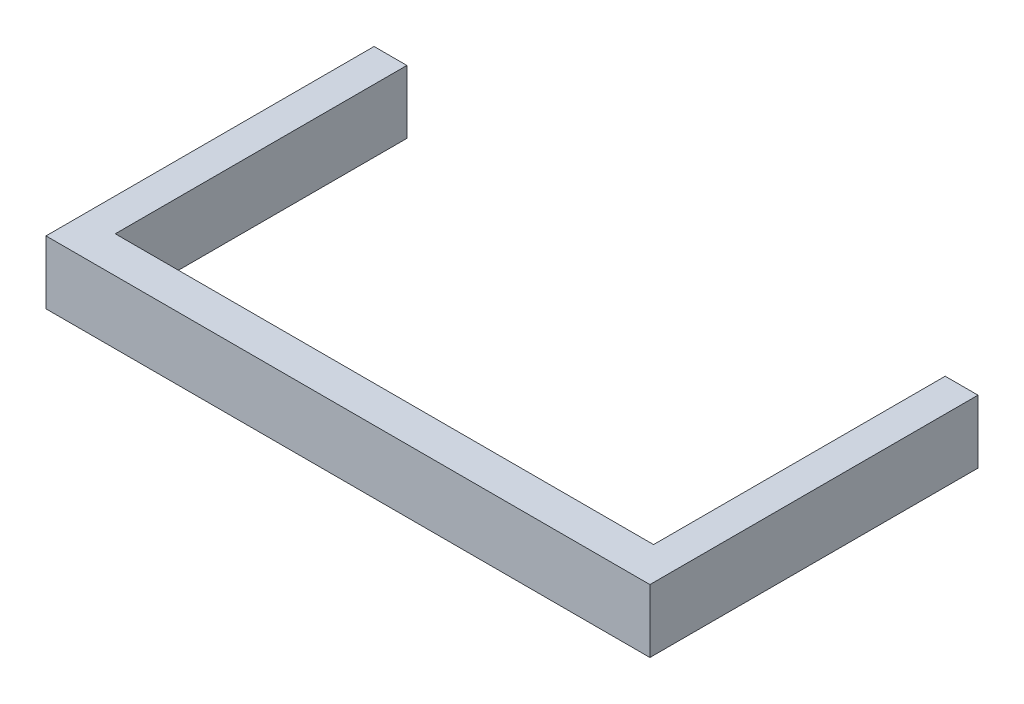
ISO-10303-21;
HEADER;
FILE_DESCRIPTION(('STEP AP214'),'2;1');
FILE_NAME('part.step','',(''),(''),'','','');
FILE_SCHEMA(('AUTOMOTIVE_DESIGN { 1 0 10303 214 1 1 1 1 }'));
ENDSEC;
DATA;
#1=APPLICATION_CONTEXT('core data for automotive mechanical design processes');
#2=APPLICATION_PROTOCOL_DEFINITION('international standard','automotive_design',2000,#1);
#3=PRODUCT_CONTEXT('',#1,'mechanical');
#4=PRODUCT('Part','Part','',(#3));
#5=PRODUCT_RELATED_PRODUCT_CATEGORY('part','',(#4));
#6=PRODUCT_DEFINITION_FORMATION('','',#4);
#7=PRODUCT_DEFINITION_CONTEXT('part definition',#1,'design');
#8=PRODUCT_DEFINITION('design','',#6,#7);
#9=PRODUCT_DEFINITION_SHAPE('','',#8);
#10=(LENGTH_UNIT() NAMED_UNIT(*) SI_UNIT(.MILLI.,.METRE.));
#11=(NAMED_UNIT(*) PLANE_ANGLE_UNIT() SI_UNIT($,.RADIAN.));
#12=(NAMED_UNIT(*) SI_UNIT($,.STERADIAN.) SOLID_ANGLE_UNIT());
#13=UNCERTAINTY_MEASURE_WITH_UNIT(LENGTH_MEASURE(1.E-05),#10,'distance_accuracy_value','');
#14=(GEOMETRIC_REPRESENTATION_CONTEXT(3) GLOBAL_UNCERTAINTY_ASSIGNED_CONTEXT((#13)) GLOBAL_UNIT_ASSIGNED_CONTEXT((#10,
#11,#12)) REPRESENTATION_CONTEXT('',''));
#15=CARTESIAN_POINT('',(0.,0.,0.));
#16=DIRECTION('',(0.,0.,1.));
#17=DIRECTION('',(1.,0.,0.));
#18=AXIS2_PLACEMENT_3D('',#15,#16,#17);
#19=CARTESIAN_POINT('',(-47.,5.2,24.));
#20=DIRECTION('',(0.,0.,1.));
#21=DIRECTION('',(1.,0.,0.));
#22=AXIS2_PLACEMENT_3D('',#19,#20,#21);
#23=PLANE('',#22);
#24=DIRECTION('',(0.,-1.,0.));
#25=VECTOR('',#24,1.);
#26=CARTESIAN_POINT('',(-44.3,5.2,24.));
#27=LINE('',#26,#25);
#28=CARTESIAN_POINT('',(-44.3,5.2,24.));
#29=VERTEX_POINT('',#28);
#30=CARTESIAN_POINT('',(-44.3,0.,24.));
#31=VERTEX_POINT('',#30);
#32=EDGE_CURVE('E195',#29,#31,#27,.T.);
#33=ORIENTED_EDGE('',*,*,#32,.F.);
#34=DIRECTION('',(1.,0.,0.));
#35=VECTOR('',#34,1.);
#36=CARTESIAN_POINT('',(-47.,5.2,24.));
#37=LINE('',#36,#35);
#38=CARTESIAN_POINT('',(0.,5.2,24.));
#39=VERTEX_POINT('',#38);
#40=EDGE_CURVE('E55',#29,#39,#37,.T.);
#41=ORIENTED_EDGE('',*,*,#40,.T.);
#42=DIRECTION('',(0.,-1.,0.));
#43=VECTOR('',#42,1.);
#44=CARTESIAN_POINT('',(0.,5.2,24.));
#45=LINE('',#44,#43);
#46=CARTESIAN_POINT('',(0.,0.,24.));
#47=VERTEX_POINT('',#46);
#48=EDGE_CURVE('E87',#39,#47,#45,.T.);
#49=ORIENTED_EDGE('',*,*,#48,.T.);
#50=DIRECTION('',(1.,0.,0.));
#51=VECTOR('',#50,1.);
#52=CARTESIAN_POINT('',(-47.,0.,24.));
#53=LINE('',#52,#51);
#54=EDGE_CURVE('E112',#31,#47,#53,.T.);
#55=ORIENTED_EDGE('',*,*,#54,.F.);
#56=EDGE_LOOP('',(#33,#41,#49,#55));
#57=FACE_BOUND('',#56,.T.);
#58=ADVANCED_FACE('F39',(#57),#23,.F.);
#59=CARTESIAN_POINT('',(0.,0.,27.));
#60=DIRECTION('',(1.,0.,0.));
#61=DIRECTION('',(0.,1.,0.));
#62=AXIS2_PLACEMENT_3D('',#59,#60,#61);
#63=PLANE('',#62);
#64=ORIENTED_EDGE('',*,*,#48,.F.);
#65=DIRECTION('',(0.,0.,-1.));
#66=VECTOR('',#65,1.);
#67=CARTESIAN_POINT('',(0.,5.2,27.));
#68=LINE('',#67,#66);
#69=CARTESIAN_POINT('',(0.,5.2,0.));
#70=VERTEX_POINT('',#69);
#71=EDGE_CURVE('E82',#39,#70,#68,.T.);
#72=ORIENTED_EDGE('',*,*,#71,.T.);
#73=DIRECTION('',(0.,-1.,0.));
#74=VECTOR('',#73,1.);
#75=CARTESIAN_POINT('',(0.,0.,0.));
#76=LINE('',#75,#74);
#77=CARTESIAN_POINT('',(0.,0.,0.));
#78=VERTEX_POINT('',#77);
#79=EDGE_CURVE('E86',#70,#78,#76,.T.);
#80=ORIENTED_EDGE('',*,*,#79,.T.);
#81=DIRECTION('',(0.,0.,-1.));
#82=VECTOR('',#81,1.);
#83=CARTESIAN_POINT('',(0.,0.,27.));
#84=LINE('',#83,#82);
#85=EDGE_CURVE('E11',#47,#78,#84,.T.);
#86=ORIENTED_EDGE('',*,*,#85,.F.);
#87=EDGE_LOOP('',(#64,#72,#80,#86));
#88=FACE_BOUND('',#87,.T.);
#89=ADVANCED_FACE('F41',(#88),#63,.F.);
#90=CARTESIAN_POINT('',(0.,0.,27.));
#91=DIRECTION('',(0.,1.,0.));
#92=DIRECTION('',(0.,0.,1.));
#93=AXIS2_PLACEMENT_3D('',#90,#91,#92);
#94=PLANE('',#93);
#95=DIRECTION('',(1.,0.,0.));
#96=VECTOR('',#95,1.);
#97=CARTESIAN_POINT('',(0.,0.,0.));
#98=LINE('',#97,#96);
#99=CARTESIAN_POINT('',(2.7,0.,0.));
#100=VERTEX_POINT('',#99);
#101=EDGE_CURVE('E106',#78,#100,#98,.T.);
#102=ORIENTED_EDGE('',*,*,#101,.T.);
#103=DIRECTION('',(0.,0.,-1.));
#104=VECTOR('',#103,1.);
#105=CARTESIAN_POINT('',(2.7,0.,27.));
#106=LINE('',#105,#104);
#107=CARTESIAN_POINT('',(2.7,0.,27.));
#108=VERTEX_POINT('',#107);
#109=EDGE_CURVE('E48',#108,#100,#106,.T.);
#110=ORIENTED_EDGE('',*,*,#109,.F.);
#111=DIRECTION('',(1.,0.,0.));
#112=VECTOR('',#111,1.);
#113=CARTESIAN_POINT('',(0.,0.,27.));
#114=LINE('',#113,#112);
#115=CARTESIAN_POINT('',(-47.,0.,27.));
#116=VERTEX_POINT('',#115);
#117=EDGE_CURVE('E101',#116,#108,#114,.T.);
#118=ORIENTED_EDGE('',*,*,#117,.F.);
#119=DIRECTION('',(0.,0.,1.));
#120=VECTOR('',#119,1.);
#121=CARTESIAN_POINT('',(-47.,0.,24.));
#122=LINE('',#121,#120);
#123=CARTESIAN_POINT('',(-47.,0.,0.));
#124=VERTEX_POINT('',#123);
#125=EDGE_CURVE('E151',#124,#116,#122,.T.);
#126=ORIENTED_EDGE('',*,*,#125,.F.);
#127=DIRECTION('',(-1.,0.,0.));
#128=VECTOR('',#127,1.);
#129=CARTESIAN_POINT('',(-47.,0.,0.));
#130=LINE('',#129,#128);
#131=CARTESIAN_POINT('',(-44.3,0.,0.));
#132=VERTEX_POINT('',#131);
#133=EDGE_CURVE('E179',#132,#124,#130,.T.);
#134=ORIENTED_EDGE('',*,*,#133,.F.);
#135=DIRECTION('',(0.,0.,1.));
#136=VECTOR('',#135,1.);
#137=CARTESIAN_POINT('',(-44.3,0.,0.));
#138=LINE('',#137,#136);
#139=EDGE_CURVE('E147',#132,#31,#138,.T.);
#140=ORIENTED_EDGE('',*,*,#139,.T.);
#141=ORIENTED_EDGE('',*,*,#54,.T.);
#142=ORIENTED_EDGE('',*,*,#85,.T.);
#143=EDGE_LOOP('',(#102,#110,#118,#126,#134,#140,#141,#142));
#144=FACE_BOUND('',#143,.T.);
#145=ADVANCED_FACE('F127',(#144),#94,.F.);
#146=CARTESIAN_POINT('',(2.7,0.,27.));
#147=DIRECTION('',(-1.,0.,0.));
#148=DIRECTION('',(0.,-1.,0.));
#149=AXIS2_PLACEMENT_3D('',#146,#147,#148);
#150=PLANE('',#149);
#151=DIRECTION('',(0.,1.,0.));
#152=VECTOR('',#151,1.);
#153=CARTESIAN_POINT('',(2.7,0.,0.));
#154=LINE('',#153,#152);
#155=CARTESIAN_POINT('',(2.7,5.2,0.));
#156=VERTEX_POINT('',#155);
#157=EDGE_CURVE('E102',#100,#156,#154,.T.);
#158=ORIENTED_EDGE('',*,*,#157,.T.);
#159=DIRECTION('',(0.,0.,-1.));
#160=VECTOR('',#159,1.);
#161=CARTESIAN_POINT('',(2.7,5.2,27.));
#162=LINE('',#161,#160);
#163=CARTESIAN_POINT('',(2.7,5.2,27.));
#164=VERTEX_POINT('',#163);
#165=EDGE_CURVE('E90',#164,#156,#162,.T.);
#166=ORIENTED_EDGE('',*,*,#165,.F.);
#167=DIRECTION('',(0.,1.,0.));
#168=VECTOR('',#167,1.);
#169=CARTESIAN_POINT('',(2.7,0.,27.));
#170=LINE('',#169,#168);
#171=EDGE_CURVE('E64',#108,#164,#170,.T.);
#172=ORIENTED_EDGE('',*,*,#171,.F.);
#173=ORIENTED_EDGE('',*,*,#109,.T.);
#174=EDGE_LOOP('',(#158,#166,#172,#173));
#175=FACE_BOUND('',#174,.T.);
#176=ADVANCED_FACE('F124',(#175),#150,.F.);
#177=CARTESIAN_POINT('',(0.,5.2,27.));
#178=DIRECTION('',(0.,-1.,0.));
#179=DIRECTION('',(0.,0.,-1.));
#180=AXIS2_PLACEMENT_3D('',#177,#178,#179);
#181=PLANE('',#180);
#182=DIRECTION('',(-1.,0.,0.));
#183=VECTOR('',#182,1.);
#184=CARTESIAN_POINT('',(0.,5.2,0.));
#185=LINE('',#184,#183);
#186=EDGE_CURVE('E95',#156,#70,#185,.T.);
#187=ORIENTED_EDGE('',*,*,#186,.T.);
#188=ORIENTED_EDGE('',*,*,#71,.F.);
#189=ORIENTED_EDGE('',*,*,#40,.F.);
#190=DIRECTION('',(0.,0.,1.));
#191=VECTOR('',#190,1.);
#192=CARTESIAN_POINT('',(-44.3,5.2,0.));
#193=LINE('',#192,#191);
#194=CARTESIAN_POINT('',(-44.3,5.2,0.));
#195=VERTEX_POINT('',#194);
#196=EDGE_CURVE('E139',#195,#29,#193,.T.);
#197=ORIENTED_EDGE('',*,*,#196,.F.);
#198=DIRECTION('',(1.,0.,0.));
#199=VECTOR('',#198,1.);
#200=CARTESIAN_POINT('',(-47.,5.2,0.));
#201=LINE('',#200,#199);
#202=CARTESIAN_POINT('',(-47.,5.2,0.));
#203=VERTEX_POINT('',#202);
#204=EDGE_CURVE('E167',#203,#195,#201,.T.);
#205=ORIENTED_EDGE('',*,*,#204,.F.);
#206=DIRECTION('',(0.,0.,-1.));
#207=VECTOR('',#206,1.);
#208=CARTESIAN_POINT('',(-47.,5.2,27.));
#209=LINE('',#208,#207);
#210=CARTESIAN_POINT('',(-47.,5.2,27.));
#211=VERTEX_POINT('',#210);
#212=EDGE_CURVE('E144',#211,#203,#209,.T.);
#213=ORIENTED_EDGE('',*,*,#212,.F.);
#214=DIRECTION('',(-1.,0.,0.));
#215=VECTOR('',#214,1.);
#216=CARTESIAN_POINT('',(0.,5.2,27.));
#217=LINE('',#216,#215);
#218=EDGE_CURVE('E91',#164,#211,#217,.T.);
#219=ORIENTED_EDGE('',*,*,#218,.F.);
#220=ORIENTED_EDGE('',*,*,#165,.T.);
#221=EDGE_LOOP('',(#187,#188,#189,#197,#205,#213,#219,#220));
#222=FACE_BOUND('',#221,.T.);
#223=ADVANCED_FACE('F96',(#222),#181,.F.);
#224=CARTESIAN_POINT('',(0.,0.,27.));
#225=DIRECTION('',(0.,0.,-1.));
#226=DIRECTION('',(-1.,0.,0.));
#227=AXIS2_PLACEMENT_3D('',#224,#225,#226);
#228=PLANE('',#227);
#229=ORIENTED_EDGE('',*,*,#218,.T.);
#230=DIRECTION('',(0.,1.,0.));
#231=VECTOR('',#230,1.);
#232=CARTESIAN_POINT('',(-47.,0.,27.));
#233=LINE('',#232,#231);
#234=EDGE_CURVE('E138',#116,#211,#233,.T.);
#235=ORIENTED_EDGE('',*,*,#234,.F.);
#236=ORIENTED_EDGE('',*,*,#117,.T.);
#237=ORIENTED_EDGE('',*,*,#171,.T.);
#238=EDGE_LOOP('',(#229,#235,#236,#237));
#239=FACE_BOUND('',#238,.T.);
#240=ADVANCED_FACE('F160',(#239),#228,.F.);
#241=CARTESIAN_POINT('',(0.,0.,0.));
#242=DIRECTION('',(0.,0.,-1.));
#243=DIRECTION('',(-1.,0.,0.));
#244=AXIS2_PLACEMENT_3D('',#241,#242,#243);
#245=PLANE('',#244);
#246=ORIENTED_EDGE('',*,*,#79,.F.);
#247=ORIENTED_EDGE('',*,*,#186,.F.);
#248=ORIENTED_EDGE('',*,*,#157,.F.);
#249=ORIENTED_EDGE('',*,*,#101,.F.);
#250=EDGE_LOOP('',(#246,#247,#248,#249));
#251=FACE_BOUND('',#250,.T.);
#252=ADVANCED_FACE('F105',(#251),#245,.T.);
#253=CARTESIAN_POINT('',(-47.,0.,0.));
#254=DIRECTION('',(-1.,0.,0.));
#255=DIRECTION('',(0.,0.,1.));
#256=AXIS2_PLACEMENT_3D('',#253,#254,#255);
#257=PLANE('',#256);
#258=ORIENTED_EDGE('',*,*,#234,.T.);
#259=ORIENTED_EDGE('',*,*,#212,.T.);
#260=DIRECTION('',(0.,1.,0.));
#261=VECTOR('',#260,1.);
#262=CARTESIAN_POINT('',(-47.,5.2,0.));
#263=LINE('',#262,#261);
#264=EDGE_CURVE('E173',#124,#203,#263,.T.);
#265=ORIENTED_EDGE('',*,*,#264,.F.);
#266=ORIENTED_EDGE('',*,*,#125,.T.);
#267=EDGE_LOOP('',(#258,#259,#265,#266));
#268=FACE_BOUND('',#267,.T.);
#269=ADVANCED_FACE('F172',(#268),#257,.T.);
#270=CARTESIAN_POINT('',(-44.3,5.2,0.));
#271=DIRECTION('',(-1.,0.,0.));
#272=DIRECTION('',(0.,0.,1.));
#273=AXIS2_PLACEMENT_3D('',#270,#271,#272);
#274=PLANE('',#273);
#275=ORIENTED_EDGE('',*,*,#32,.T.);
#276=ORIENTED_EDGE('',*,*,#139,.F.);
#277=DIRECTION('',(0.,-1.,0.));
#278=VECTOR('',#277,1.);
#279=CARTESIAN_POINT('',(-44.3,5.2,0.));
#280=LINE('',#279,#278);
#281=EDGE_CURVE('E185',#195,#132,#280,.T.);
#282=ORIENTED_EDGE('',*,*,#281,.F.);
#283=ORIENTED_EDGE('',*,*,#196,.T.);
#284=EDGE_LOOP('',(#275,#276,#282,#283));
#285=FACE_BOUND('',#284,.T.);
#286=ADVANCED_FACE('F205',(#285),#274,.F.);
#287=CARTESIAN_POINT('',(0.,0.,0.));
#288=DIRECTION('',(0.,0.,1.));
#289=DIRECTION('',(1.,0.,0.));
#290=AXIS2_PLACEMENT_3D('',#287,#288,#289);
#291=PLANE('',#290);
#292=ORIENTED_EDGE('',*,*,#264,.T.);
#293=ORIENTED_EDGE('',*,*,#204,.T.);
#294=ORIENTED_EDGE('',*,*,#281,.T.);
#295=ORIENTED_EDGE('',*,*,#133,.T.);
#296=EDGE_LOOP('',(#292,#293,#294,#295));
#297=FACE_BOUND('',#296,.T.);
#298=ADVANCED_FACE('F183',(#297),#291,.F.);
#299=CLOSED_SHELL('',(#58,#89,#145,#176,#223,#240,#252,#269,#286,#298));
#300=MANIFOLD_SOLID_BREP('B2',#299);
#301=ADVANCED_BREP_SHAPE_REPRESENTATION('',(#18,#300),#14);
#302=SHAPE_DEFINITION_REPRESENTATION(#9,#301);
ENDSEC;
END-ISO-10303-21;
